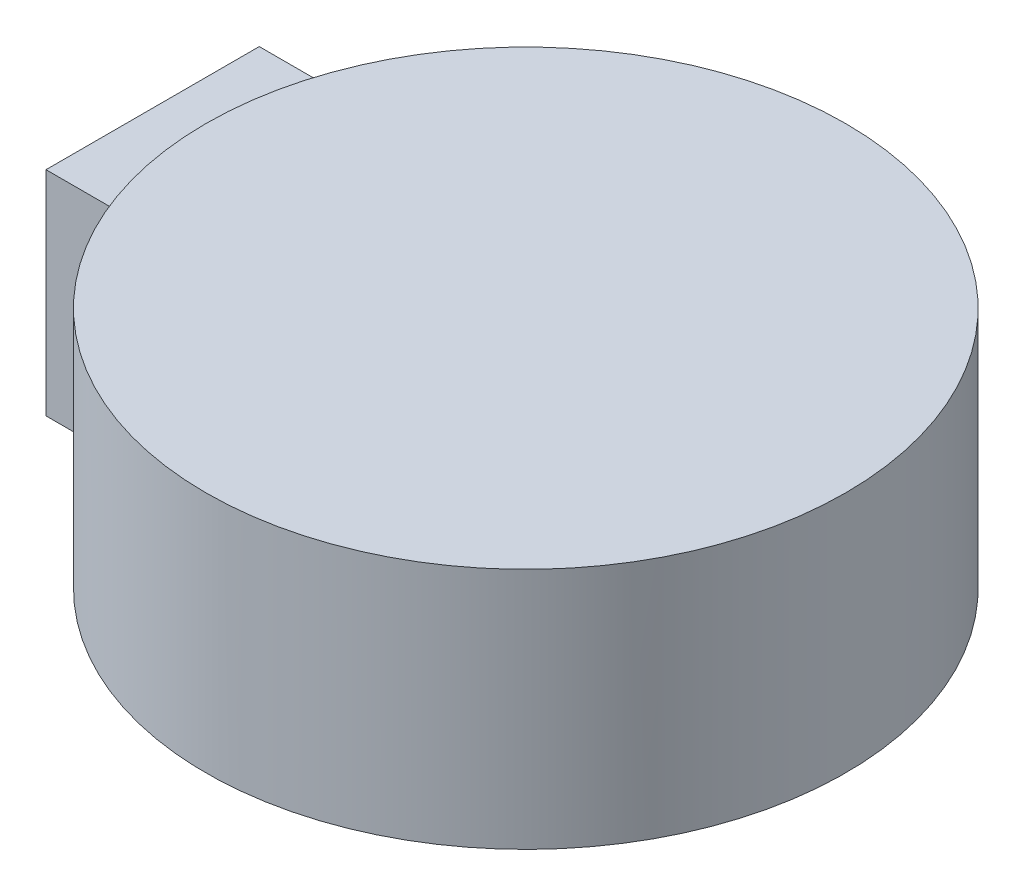
ISO-10303-21;
HEADER;
FILE_DESCRIPTION(('STEP AP214'),'2;1');
FILE_NAME('part.step','',(''),(''),'','','');
FILE_SCHEMA(('AUTOMOTIVE_DESIGN { 1 0 10303 214 1 1 1 1 }'));
ENDSEC;
DATA;
#1=APPLICATION_CONTEXT('core data for automotive mechanical design processes');
#2=APPLICATION_PROTOCOL_DEFINITION('international standard','automotive_design',2000,#1);
#3=PRODUCT_CONTEXT('',#1,'mechanical');
#4=PRODUCT('Part','Part','',(#3));
#5=PRODUCT_RELATED_PRODUCT_CATEGORY('part','',(#4));
#6=PRODUCT_DEFINITION_FORMATION('','',#4);
#7=PRODUCT_DEFINITION_CONTEXT('part definition',#1,'design');
#8=PRODUCT_DEFINITION('design','',#6,#7);
#9=PRODUCT_DEFINITION_SHAPE('','',#8);
#10=(LENGTH_UNIT() NAMED_UNIT(*) SI_UNIT(.MILLI.,.METRE.));
#11=(NAMED_UNIT(*) PLANE_ANGLE_UNIT() SI_UNIT($,.RADIAN.));
#12=(NAMED_UNIT(*) SI_UNIT($,.STERADIAN.) SOLID_ANGLE_UNIT());
#13=UNCERTAINTY_MEASURE_WITH_UNIT(LENGTH_MEASURE(1.E-05),#10,'distance_accuracy_value','');
#14=(GEOMETRIC_REPRESENTATION_CONTEXT(3) GLOBAL_UNCERTAINTY_ASSIGNED_CONTEXT((#13)) GLOBAL_UNIT_ASSIGNED_CONTEXT((#10,
#11,#12)) REPRESENTATION_CONTEXT('',''));
#15=CARTESIAN_POINT('',(0.,0.,0.));
#16=DIRECTION('',(0.,0.,1.));
#17=DIRECTION('',(1.,0.,0.));
#18=AXIS2_PLACEMENT_3D('',#15,#16,#17);
#19=CARTESIAN_POINT('',(0.,20.,0.));
#20=DIRECTION('',(0.,-1.,0.));
#21=DIRECTION('',(0.,0.,-1.));
#22=AXIS2_PLACEMENT_3D('',#19,#20,#21);
#23=CYLINDRICAL_SURFACE('',#22,60.);
#24=DIRECTION('',(0.,-1.,0.));
#25=VECTOR('',#24,1.);
#26=CARTESIAN_POINT('',(-56.5685424949238,20.,-20.));
#27=LINE('',#26,#25);
#28=CARTESIAN_POINT('',(-56.5685424949238,-7.50000000000001,-20.));
#29=VERTEX_POINT('',#28);
#30=CARTESIAN_POINT('',(-56.5685424949238,32.5,-20.));
#31=VERTEX_POINT('',#30);
#32=EDGE_CURVE('E75',#29,#31,#27,.F.);
#33=ORIENTED_EDGE('',*,*,#32,.T.);
#34=CARTESIAN_POINT('',(0.,32.5,0.));
#35=DIRECTION('',(0.,-1.,0.));
#36=DIRECTION('',(0.,0.,-1.));
#37=AXIS2_PLACEMENT_3D('',#34,#35,#36);
#38=CIRCLE('',#37,60.);
#39=CARTESIAN_POINT('',(-56.5685424949238,32.5,20.));
#40=VERTEX_POINT('',#39);
#41=EDGE_CURVE('E101',#31,#40,#38,.F.);
#42=ORIENTED_EDGE('',*,*,#41,.T.);
#43=DIRECTION('',(0.,-1.,0.));
#44=VECTOR('',#43,1.);
#45=CARTESIAN_POINT('',(-56.5685424949238,20.,20.));
#46=LINE('',#45,#44);
#47=CARTESIAN_POINT('',(-56.5685424949238,-7.50000000000001,20.));
#48=VERTEX_POINT('',#47);
#49=EDGE_CURVE('E42',#40,#48,#46,.T.);
#50=ORIENTED_EDGE('',*,*,#49,.T.);
#51=CARTESIAN_POINT('',(0.,-7.50000000000001,0.));
#52=DIRECTION('',(0.,1.,0.));
#53=DIRECTION('',(0.,0.,1.));
#54=AXIS2_PLACEMENT_3D('',#51,#52,#53);
#55=CIRCLE('',#54,60.);
#56=EDGE_CURVE('E90',#48,#29,#55,.F.);
#57=ORIENTED_EDGE('',*,*,#56,.T.);
#58=EDGE_LOOP('',(#33,#42,#50,#57));
#59=FACE_BOUND('',#58,.T.);
#60=CARTESIAN_POINT('',(0.,-10.5,0.));
#61=DIRECTION('',(0.,-1.,0.));
#62=DIRECTION('',(0.,0.,-1.));
#63=AXIS2_PLACEMENT_3D('',#60,#61,#62);
#64=CIRCLE('',#63,60.);
#65=CARTESIAN_POINT('',(0.,-10.5,-60.));
#66=VERTEX_POINT('',#65);
#67=EDGE_CURVE('E130',#66,#66,#64,.T.);
#68=ORIENTED_EDGE('',*,*,#67,.F.);
#69=EDGE_LOOP('',(#68));
#70=FACE_BOUND('',#69,.T.);
#71=CARTESIAN_POINT('',(0.,35.,0.));
#72=DIRECTION('',(0.,1.,0.));
#73=DIRECTION('',(0.,0.,1.));
#74=AXIS2_PLACEMENT_3D('',#71,#72,#73);
#75=CIRCLE('',#74,60.);
#76=CARTESIAN_POINT('',(0.,35.,60.));
#77=VERTEX_POINT('',#76);
#78=EDGE_CURVE('E138',#77,#77,#75,.T.);
#79=ORIENTED_EDGE('',*,*,#78,.F.);
#80=EDGE_LOOP('',(#79));
#81=FACE_BOUND('',#80,.T.);
#82=ADVANCED_FACE('F34',(#59,#70,#81),#23,.T.);
#83=CARTESIAN_POINT('',(60.001,-7.50000000000001,-20.));
#84=DIRECTION('',(0.,0.,1.));
#85=DIRECTION('',(1.,0.,0.));
#86=AXIS2_PLACEMENT_3D('',#83,#84,#85);
#87=PLANE('',#86);
#88=ORIENTED_EDGE('',*,*,#32,.F.);
#89=DIRECTION('',(-1.,0.,0.));
#90=VECTOR('',#89,1.);
#91=CARTESIAN_POINT('',(60.001,-7.50000000000001,-20.));
#92=LINE('',#91,#90);
#93=CARTESIAN_POINT('',(-70.,-7.50000000000001,-20.));
#94=VERTEX_POINT('',#93);
#95=EDGE_CURVE('E78',#29,#94,#92,.T.);
#96=ORIENTED_EDGE('',*,*,#95,.T.);
#97=DIRECTION('',(0.,1.,0.));
#98=VECTOR('',#97,1.);
#99=CARTESIAN_POINT('',(-70.,-7.50000000000001,-20.));
#100=LINE('',#99,#98);
#101=CARTESIAN_POINT('',(-70.,32.5,-20.));
#102=VERTEX_POINT('',#101);
#103=EDGE_CURVE('E81',#94,#102,#100,.T.);
#104=ORIENTED_EDGE('',*,*,#103,.T.);
#105=DIRECTION('',(-1.,0.,0.));
#106=VECTOR('',#105,1.);
#107=CARTESIAN_POINT('',(60.001,32.5,-20.));
#108=LINE('',#107,#106);
#109=EDGE_CURVE('E95',#31,#102,#108,.T.);
#110=ORIENTED_EDGE('',*,*,#109,.F.);
#111=EDGE_LOOP('',(#88,#96,#104,#110));
#112=FACE_BOUND('',#111,.T.);
#113=ADVANCED_FACE('F79',(#112),#87,.F.);
#114=CARTESIAN_POINT('',(60.001,32.5,20.));
#115=DIRECTION('',(0.,-1.,0.));
#116=DIRECTION('',(0.,0.,-1.));
#117=AXIS2_PLACEMENT_3D('',#114,#115,#116);
#118=PLANE('',#117);
#119=ORIENTED_EDGE('',*,*,#41,.F.);
#120=ORIENTED_EDGE('',*,*,#109,.T.);
#121=DIRECTION('',(0.,0.,1.));
#122=VECTOR('',#121,1.);
#123=CARTESIAN_POINT('',(-70.,32.5,20.));
#124=LINE('',#123,#122);
#125=CARTESIAN_POINT('',(-70.,32.5,20.));
#126=VERTEX_POINT('',#125);
#127=EDGE_CURVE('E94',#102,#126,#124,.T.);
#128=ORIENTED_EDGE('',*,*,#127,.T.);
#129=DIRECTION('',(-1.,0.,0.));
#130=VECTOR('',#129,1.);
#131=CARTESIAN_POINT('',(60.001,32.5,20.));
#132=LINE('',#131,#130);
#133=EDGE_CURVE('E62',#40,#126,#132,.T.);
#134=ORIENTED_EDGE('',*,*,#133,.F.);
#135=EDGE_LOOP('',(#119,#120,#128,#134));
#136=FACE_BOUND('',#135,.T.);
#137=ADVANCED_FACE('F149',(#136),#118,.F.);
#138=CARTESIAN_POINT('',(60.001,-7.50000000000001,20.));
#139=DIRECTION('',(0.,0.,-1.));
#140=DIRECTION('',(-1.,0.,0.));
#141=AXIS2_PLACEMENT_3D('',#138,#139,#140);
#142=PLANE('',#141);
#143=ORIENTED_EDGE('',*,*,#49,.F.);
#144=ORIENTED_EDGE('',*,*,#133,.T.);
#145=DIRECTION('',(0.,-1.,0.));
#146=VECTOR('',#145,1.);
#147=CARTESIAN_POINT('',(-70.,-7.50000000000001,20.));
#148=LINE('',#147,#146);
#149=CARTESIAN_POINT('',(-70.,-7.50000000000001,20.));
#150=VERTEX_POINT('',#149);
#151=EDGE_CURVE('E107',#126,#150,#148,.T.);
#152=ORIENTED_EDGE('',*,*,#151,.T.);
#153=DIRECTION('',(-1.,0.,0.));
#154=VECTOR('',#153,1.);
#155=CARTESIAN_POINT('',(60.001,-7.50000000000001,20.));
#156=LINE('',#155,#154);
#157=EDGE_CURVE('E50',#48,#150,#156,.T.);
#158=ORIENTED_EDGE('',*,*,#157,.F.);
#159=EDGE_LOOP('',(#143,#144,#152,#158));
#160=FACE_BOUND('',#159,.T.);
#161=ADVANCED_FACE('F176',(#160),#142,.F.);
#162=CARTESIAN_POINT('',(60.001,-7.50000000000001,20.));
#163=DIRECTION('',(0.,1.,0.));
#164=DIRECTION('',(0.,0.,1.));
#165=AXIS2_PLACEMENT_3D('',#162,#163,#164);
#166=PLANE('',#165);
#167=ORIENTED_EDGE('',*,*,#56,.F.);
#168=ORIENTED_EDGE('',*,*,#157,.T.);
#169=DIRECTION('',(0.,0.,-1.));
#170=VECTOR('',#169,1.);
#171=CARTESIAN_POINT('',(-70.,-7.50000000000001,20.));
#172=LINE('',#171,#170);
#173=EDGE_CURVE('E86',#150,#94,#172,.T.);
#174=ORIENTED_EDGE('',*,*,#173,.T.);
#175=ORIENTED_EDGE('',*,*,#95,.F.);
#176=EDGE_LOOP('',(#167,#168,#174,#175));
#177=FACE_BOUND('',#176,.T.);
#178=ADVANCED_FACE('F87',(#177),#166,.F.);
#179=CARTESIAN_POINT('',(-70.,0.,0.));
#180=DIRECTION('',(-1.,0.,0.));
#181=DIRECTION('',(0.,0.,1.));
#182=AXIS2_PLACEMENT_3D('',#179,#180,#181);
#183=PLANE('',#182);
#184=CARTESIAN_POINT('',(-70.,27.5,-15.));
#185=DIRECTION('',(-1.,0.,0.));
#186=DIRECTION('',(0.,0.,1.));
#187=AXIS2_PLACEMENT_3D('',#184,#185,#186);
#188=CIRCLE('',#187,2.5);
#189=CARTESIAN_POINT('',(-70.,27.5,-12.5));
#190=VERTEX_POINT('',#189);
#191=EDGE_CURVE('E122',#190,#190,#188,.T.);
#192=ORIENTED_EDGE('',*,*,#191,.F.);
#193=EDGE_LOOP('',(#192));
#194=FACE_BOUND('',#193,.T.);
#195=CARTESIAN_POINT('',(-70.,-2.5,15.));
#196=DIRECTION('',(-1.,0.,0.));
#197=DIRECTION('',(0.,0.,1.));
#198=AXIS2_PLACEMENT_3D('',#195,#196,#197);
#199=CIRCLE('',#198,2.5);
#200=CARTESIAN_POINT('',(-70.,-2.5,17.5));
#201=VERTEX_POINT('',#200);
#202=EDGE_CURVE('E115',#201,#201,#199,.T.);
#203=ORIENTED_EDGE('',*,*,#202,.F.);
#204=EDGE_LOOP('',(#203));
#205=FACE_BOUND('',#204,.T.);
#206=CARTESIAN_POINT('',(-70.,-2.50000000000001,-15.));
#207=DIRECTION('',(-1.,0.,0.));
#208=DIRECTION('',(0.,0.,1.));
#209=AXIS2_PLACEMENT_3D('',#206,#207,#208);
#210=CIRCLE('',#209,2.5);
#211=CARTESIAN_POINT('',(-70.,-2.50000000000001,-12.5));
#212=VERTEX_POINT('',#211);
#213=EDGE_CURVE('E127',#212,#212,#210,.T.);
#214=ORIENTED_EDGE('',*,*,#213,.F.);
#215=EDGE_LOOP('',(#214));
#216=FACE_BOUND('',#215,.T.);
#217=CARTESIAN_POINT('',(-70.,27.5,15.));
#218=DIRECTION('',(-1.,0.,0.));
#219=DIRECTION('',(0.,0.,1.));
#220=AXIS2_PLACEMENT_3D('',#217,#218,#219);
#221=CIRCLE('',#220,2.5);
#222=CARTESIAN_POINT('',(-70.,27.5,17.5));
#223=VERTEX_POINT('',#222);
#224=EDGE_CURVE('E109',#223,#223,#221,.T.);
#225=ORIENTED_EDGE('',*,*,#224,.F.);
#226=EDGE_LOOP('',(#225));
#227=FACE_BOUND('',#226,.T.);
#228=ORIENTED_EDGE('',*,*,#103,.F.);
#229=ORIENTED_EDGE('',*,*,#173,.F.);
#230=ORIENTED_EDGE('',*,*,#151,.F.);
#231=ORIENTED_EDGE('',*,*,#127,.F.);
#232=EDGE_LOOP('',(#228,#229,#230,#231));
#233=FACE_BOUND('',#232,.T.);
#234=ADVANCED_FACE('F93',(#194,#205,#216,#227,#233),#183,.T.);
#235=CARTESIAN_POINT('',(-65.,27.5,15.));
#236=DIRECTION('',(-1.,0.,0.));
#237=DIRECTION('',(0.,0.,1.));
#238=AXIS2_PLACEMENT_3D('',#235,#236,#237);
#239=CYLINDRICAL_SURFACE('',#238,2.5);
#240=CARTESIAN_POINT('',(-65.,27.5,15.));
#241=DIRECTION('',(-1.,0.,0.));
#242=DIRECTION('',(0.,0.,1.));
#243=AXIS2_PLACEMENT_3D('',#240,#241,#242);
#244=CIRCLE('',#243,2.5);
#245=CARTESIAN_POINT('',(-65.,27.5,17.5));
#246=VERTEX_POINT('',#245);
#247=EDGE_CURVE('E83',#246,#246,#244,.T.);
#248=ORIENTED_EDGE('',*,*,#247,.F.);
#249=EDGE_LOOP('',(#248));
#250=FACE_BOUND('',#249,.T.);
#251=ORIENTED_EDGE('',*,*,#224,.T.);
#252=EDGE_LOOP('',(#251));
#253=FACE_BOUND('',#252,.T.);
#254=ADVANCED_FACE('F184',(#250,#253),#239,.F.);
#255=CARTESIAN_POINT('',(-65.,27.5,15.));
#256=DIRECTION('',(-1.,0.,0.));
#257=DIRECTION('',(0.,0.,1.));
#258=AXIS2_PLACEMENT_3D('',#255,#256,#257);
#259=PLANE('',#258);
#260=ORIENTED_EDGE('',*,*,#247,.T.);
#261=EDGE_LOOP('',(#260));
#262=FACE_BOUND('',#261,.T.);
#263=ADVANCED_FACE('F188',(#262),#259,.T.);
#264=CARTESIAN_POINT('',(-65.,-2.50000000000001,-15.));
#265=DIRECTION('',(-1.,0.,0.));
#266=DIRECTION('',(0.,0.,1.));
#267=AXIS2_PLACEMENT_3D('',#264,#265,#266);
#268=CYLINDRICAL_SURFACE('',#267,2.5);
#269=CARTESIAN_POINT('',(-65.,-2.50000000000001,-15.));
#270=DIRECTION('',(-1.,0.,0.));
#271=DIRECTION('',(0.,0.,1.));
#272=AXIS2_PLACEMENT_3D('',#269,#270,#271);
#273=CIRCLE('',#272,2.5);
#274=CARTESIAN_POINT('',(-65.,-2.50000000000001,-12.5));
#275=VERTEX_POINT('',#274);
#276=EDGE_CURVE('E119',#275,#275,#273,.T.);
#277=ORIENTED_EDGE('',*,*,#276,.F.);
#278=EDGE_LOOP('',(#277));
#279=FACE_BOUND('',#278,.T.);
#280=ORIENTED_EDGE('',*,*,#213,.T.);
#281=EDGE_LOOP('',(#280));
#282=FACE_BOUND('',#281,.T.);
#283=ADVANCED_FACE('F192',(#279,#282),#268,.F.);
#284=CARTESIAN_POINT('',(-65.,-2.50000000000001,-15.));
#285=DIRECTION('',(-1.,0.,0.));
#286=DIRECTION('',(0.,0.,1.));
#287=AXIS2_PLACEMENT_3D('',#284,#285,#286);
#288=PLANE('',#287);
#289=ORIENTED_EDGE('',*,*,#276,.T.);
#290=EDGE_LOOP('',(#289));
#291=FACE_BOUND('',#290,.T.);
#292=ADVANCED_FACE('F198',(#291),#288,.T.);
#293=CARTESIAN_POINT('',(-65.,-2.5,15.));
#294=DIRECTION('',(-1.,0.,0.));
#295=DIRECTION('',(0.,0.,1.));
#296=AXIS2_PLACEMENT_3D('',#293,#294,#295);
#297=CYLINDRICAL_SURFACE('',#296,2.5);
#298=CARTESIAN_POINT('',(-65.,-2.5,15.));
#299=DIRECTION('',(-1.,0.,0.));
#300=DIRECTION('',(0.,0.,1.));
#301=AXIS2_PLACEMENT_3D('',#298,#299,#300);
#302=CIRCLE('',#301,2.5);
#303=CARTESIAN_POINT('',(-65.,-2.5,17.5));
#304=VERTEX_POINT('',#303);
#305=EDGE_CURVE('E118',#304,#304,#302,.T.);
#306=ORIENTED_EDGE('',*,*,#305,.F.);
#307=EDGE_LOOP('',(#306));
#308=FACE_BOUND('',#307,.T.);
#309=ORIENTED_EDGE('',*,*,#202,.T.);
#310=EDGE_LOOP('',(#309));
#311=FACE_BOUND('',#310,.T.);
#312=ADVANCED_FACE('F194',(#308,#311),#297,.F.);
#313=CARTESIAN_POINT('',(-65.,-2.5,15.));
#314=DIRECTION('',(-1.,0.,0.));
#315=DIRECTION('',(0.,0.,1.));
#316=AXIS2_PLACEMENT_3D('',#313,#314,#315);
#317=PLANE('',#316);
#318=ORIENTED_EDGE('',*,*,#305,.T.);
#319=EDGE_LOOP('',(#318));
#320=FACE_BOUND('',#319,.T.);
#321=ADVANCED_FACE('F197',(#320),#317,.T.);
#322=CARTESIAN_POINT('',(-65.,27.5,-15.));
#323=DIRECTION('',(-1.,0.,0.));
#324=DIRECTION('',(0.,0.,1.));
#325=AXIS2_PLACEMENT_3D('',#322,#323,#324);
#326=CYLINDRICAL_SURFACE('',#325,2.5);
#327=CARTESIAN_POINT('',(-65.,27.5,-15.));
#328=DIRECTION('',(-1.,0.,0.));
#329=DIRECTION('',(0.,0.,1.));
#330=AXIS2_PLACEMENT_3D('',#327,#328,#329);
#331=CIRCLE('',#330,2.5);
#332=CARTESIAN_POINT('',(-65.,27.5,-12.5));
#333=VERTEX_POINT('',#332);
#334=EDGE_CURVE('E112',#333,#333,#331,.T.);
#335=ORIENTED_EDGE('',*,*,#334,.F.);
#336=EDGE_LOOP('',(#335));
#337=FACE_BOUND('',#336,.T.);
#338=ORIENTED_EDGE('',*,*,#191,.T.);
#339=EDGE_LOOP('',(#338));
#340=FACE_BOUND('',#339,.T.);
#341=ADVANCED_FACE('F202',(#337,#340),#326,.F.);
#342=CARTESIAN_POINT('',(-65.,27.5,-15.));
#343=DIRECTION('',(-1.,0.,0.));
#344=DIRECTION('',(0.,0.,1.));
#345=AXIS2_PLACEMENT_3D('',#342,#343,#344);
#346=PLANE('',#345);
#347=ORIENTED_EDGE('',*,*,#334,.T.);
#348=EDGE_LOOP('',(#347));
#349=FACE_BOUND('',#348,.T.);
#350=ADVANCED_FACE('F159',(#349),#346,.T.);
#351=CARTESIAN_POINT('',(0.,-10.5,0.));
#352=DIRECTION('',(0.,-1.,0.));
#353=DIRECTION('',(0.,0.,-1.));
#354=AXIS2_PLACEMENT_3D('',#351,#352,#353);
#355=PLANE('',#354);
#356=ORIENTED_EDGE('',*,*,#67,.T.);
#357=EDGE_LOOP('',(#356));
#358=FACE_BOUND('',#357,.T.);
#359=CARTESIAN_POINT('',(0.,-10.5,0.));
#360=DIRECTION('',(0.,-1.,0.));
#361=DIRECTION('',(0.,0.,-1.));
#362=AXIS2_PLACEMENT_3D('',#359,#360,#361);
#363=CIRCLE('',#362,40.);
#364=CARTESIAN_POINT('',(0.,-10.5,-40.));
#365=VERTEX_POINT('',#364);
#366=EDGE_CURVE('E135',#365,#365,#363,.T.);
#367=ORIENTED_EDGE('',*,*,#366,.F.);
#368=EDGE_LOOP('',(#367));
#369=FACE_BOUND('',#368,.T.);
#370=ADVANCED_FACE('F155',(#358,#369),#355,.T.);
#371=CARTESIAN_POINT('',(0.,20.,0.));
#372=DIRECTION('',(0.,1.,0.));
#373=DIRECTION('',(0.,0.,1.));
#374=AXIS2_PLACEMENT_3D('',#371,#372,#373);
#375=PLANE('',#374);
#376=CARTESIAN_POINT('',(0.,20.,0.));
#377=DIRECTION('',(0.,1.,0.));
#378=DIRECTION('',(0.,0.,1.));
#379=AXIS2_PLACEMENT_3D('',#376,#377,#378);
#380=CIRCLE('',#379,40.);
#381=CARTESIAN_POINT('',(0.,20.,40.));
#382=VERTEX_POINT('',#381);
#383=EDGE_CURVE('E11',#382,#382,#380,.T.);
#384=ORIENTED_EDGE('',*,*,#383,.F.);
#385=EDGE_LOOP('',(#384));
#386=FACE_BOUND('',#385,.T.);
#387=ADVANCED_FACE('F158',(#386),#375,.F.);
#388=CARTESIAN_POINT('',(0.,20.,0.));
#389=DIRECTION('',(0.,-1.,0.));
#390=DIRECTION('',(0.,0.,-1.));
#391=AXIS2_PLACEMENT_3D('',#388,#389,#390);
#392=CYLINDRICAL_SURFACE('',#391,40.);
#393=ORIENTED_EDGE('',*,*,#383,.T.);
#394=EDGE_LOOP('',(#393));
#395=FACE_BOUND('',#394,.T.);
#396=ORIENTED_EDGE('',*,*,#366,.T.);
#397=EDGE_LOOP('',(#396));
#398=FACE_BOUND('',#397,.T.);
#399=ADVANCED_FACE('F163',(#395,#398),#392,.F.);
#400=CARTESIAN_POINT('',(0.,35.,0.));
#401=DIRECTION('',(0.,1.,0.));
#402=DIRECTION('',(0.,0.,1.));
#403=AXIS2_PLACEMENT_3D('',#400,#401,#402);
#404=PLANE('',#403);
#405=ORIENTED_EDGE('',*,*,#78,.T.);
#406=EDGE_LOOP('',(#405));
#407=FACE_BOUND('',#406,.T.);
#408=ADVANCED_FACE('F142',(#407),#404,.T.);
#409=CLOSED_SHELL('',(#82,#113,#137,#161,#178,#234,#254,#263,#283,#292,#312,#321,#341,#350,#370,
#387,#399,#408));
#410=MANIFOLD_SOLID_BREP('B2',#409);
#411=ADVANCED_BREP_SHAPE_REPRESENTATION('',(#18,#410),#14);
#412=SHAPE_DEFINITION_REPRESENTATION(#9,#411);
ENDSEC;
END-ISO-10303-21;
